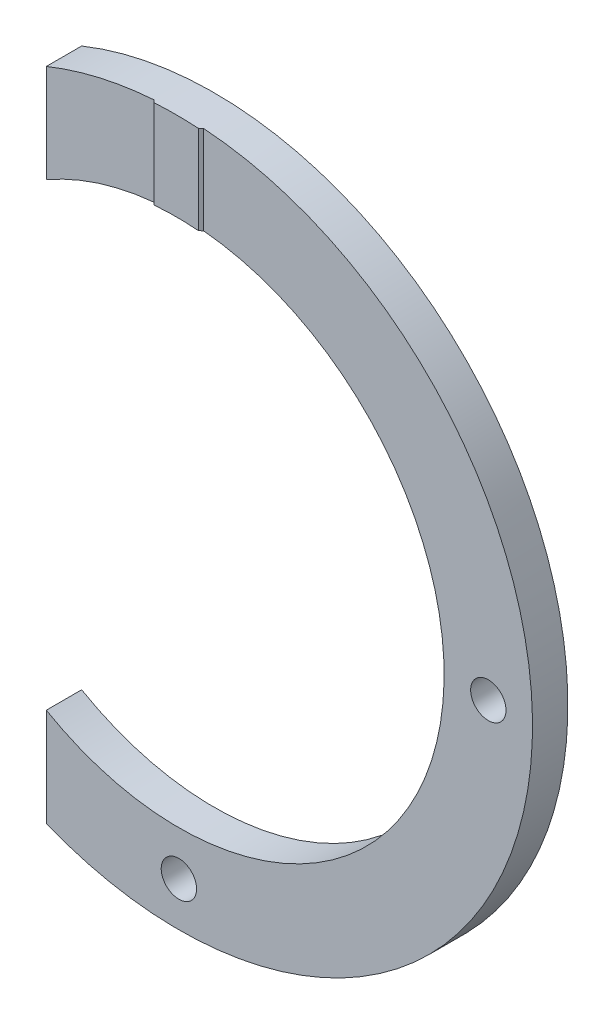
ISO-10303-21;
HEADER;
FILE_DESCRIPTION(('STEP AP214'),'2;1');
FILE_NAME('part.step','',(''),(''),'','','');
FILE_SCHEMA(('AUTOMOTIVE_DESIGN { 1 0 10303 214 1 1 1 1 }'));
ENDSEC;
DATA;
#1=APPLICATION_CONTEXT('core data for automotive mechanical design processes');
#2=APPLICATION_PROTOCOL_DEFINITION('international standard','automotive_design',2000,#1);
#3=PRODUCT_CONTEXT('',#1,'mechanical');
#4=PRODUCT('Part','Part','',(#3));
#5=PRODUCT_RELATED_PRODUCT_CATEGORY('part','',(#4));
#6=PRODUCT_DEFINITION_FORMATION('','',#4);
#7=PRODUCT_DEFINITION_CONTEXT('part definition',#1,'design');
#8=PRODUCT_DEFINITION('design','',#6,#7);
#9=PRODUCT_DEFINITION_SHAPE('','',#8);
#10=(LENGTH_UNIT() NAMED_UNIT(*) SI_UNIT(.MILLI.,.METRE.));
#11=(NAMED_UNIT(*) PLANE_ANGLE_UNIT() SI_UNIT($,.RADIAN.));
#12=(NAMED_UNIT(*) SI_UNIT($,.STERADIAN.) SOLID_ANGLE_UNIT());
#13=UNCERTAINTY_MEASURE_WITH_UNIT(LENGTH_MEASURE(1.E-05),#10,'distance_accuracy_value','');
#14=(GEOMETRIC_REPRESENTATION_CONTEXT(3) GLOBAL_UNCERTAINTY_ASSIGNED_CONTEXT((#13)) GLOBAL_UNIT_ASSIGNED_CONTEXT((#10,
#11,#12)) REPRESENTATION_CONTEXT('',''));
#15=CARTESIAN_POINT('',(0.,0.,0.));
#16=DIRECTION('',(0.,0.,1.));
#17=DIRECTION('',(1.,0.,0.));
#18=AXIS2_PLACEMENT_3D('',#15,#16,#17);
#19=CARTESIAN_POINT('',(-2.8,0.,2.));
#20=DIRECTION('',(-0.707106781186549,0.,0.707106781186547));
#21=DIRECTION('',(0.707106781186547,0.,0.707106781186549));
#22=AXIS2_PLACEMENT_3D('',#19,#20,#21);
#23=PLANE('',#22);
#24=CARTESIAN_POINT('',(0.,0.,4.80000000000001));
#25=DIRECTION('',(-0.707106781186549,0.,0.707106781186547));
#26=DIRECTION('',(-0.707106781186547,0.,-0.707106781186549));
#27=AXIS2_PLACEMENT_3D('',#24,#25,#26);
#28=ELLIPSE('',#27,42.4264068711929,30.);
#29=CARTESIAN_POINT('',(-2.8,29.8690475241511,2.));
#30=VERTEX_POINT('',#29);
#31=CARTESIAN_POINT('',(-2.5,29.8956518577535,2.3));
#32=VERTEX_POINT('',#31);
#33=EDGE_CURVE('E91',#30,#32,#28,.F.);
#34=ORIENTED_EDGE('',*,*,#33,.T.);
#35=DIRECTION('',(0.,1.,0.));
#36=VECTOR('',#35,1.);
#37=CARTESIAN_POINT('',(-2.5,0.,2.3));
#38=LINE('',#37,#36);
#39=CARTESIAN_POINT('',(-2.5,39.9217985566783,2.3));
#40=VERTEX_POINT('',#39);
#41=EDGE_CURVE('E89',#40,#32,#38,.F.);
#42=ORIENTED_EDGE('',*,*,#41,.F.);
#43=CARTESIAN_POINT('',(0.,0.,4.80000000000001));
#44=DIRECTION('',(-0.707106781186549,0.,0.707106781186547));
#45=DIRECTION('',(0.707106781186547,0.,0.707106781186549));
#46=AXIS2_PLACEMENT_3D('',#43,#44,#45);
#47=ELLIPSE('',#46,56.5685424949239,40.);
#48=CARTESIAN_POINT('',(-2.8,39.9018796549736,2.));
#49=VERTEX_POINT('',#48);
#50=EDGE_CURVE('E22',#40,#49,#47,.T.);
#51=ORIENTED_EDGE('',*,*,#50,.T.);
#52=DIRECTION('',(0.,1.,0.));
#53=VECTOR('',#52,1.);
#54=CARTESIAN_POINT('',(-2.8,0.,2.));
#55=LINE('',#54,#53);
#56=EDGE_CURVE('E86',#30,#49,#55,.T.);
#57=ORIENTED_EDGE('',*,*,#56,.F.);
#58=EDGE_LOOP('',(#34,#42,#51,#57));
#59=FACE_BOUND('',#58,.T.);
#60=ADVANCED_FACE('F19',(#59),#23,.T.);
#61=CARTESIAN_POINT('',(2.5,0.,2.3));
#62=DIRECTION('',(0.707106781186549,0.,0.707106781186547));
#63=DIRECTION('',(0.707106781186547,0.,-0.707106781186549));
#64=AXIS2_PLACEMENT_3D('',#61,#62,#63);
#65=PLANE('',#64);
#66=CARTESIAN_POINT('',(0.,0.,4.80000000000001));
#67=DIRECTION('',(0.707106781186549,0.,0.707106781186547));
#68=DIRECTION('',(0.707106781186547,0.,-0.707106781186549));
#69=AXIS2_PLACEMENT_3D('',#66,#67,#68);
#70=ELLIPSE('',#69,42.4264068711929,30.);
#71=CARTESIAN_POINT('',(2.5,29.8956518577535,2.3));
#72=VERTEX_POINT('',#71);
#73=CARTESIAN_POINT('',(2.8,29.8690475241511,2.));
#74=VERTEX_POINT('',#73);
#75=EDGE_CURVE('E113',#72,#74,#70,.F.);
#76=ORIENTED_EDGE('',*,*,#75,.T.);
#77=DIRECTION('',(0.,1.,0.));
#78=VECTOR('',#77,1.);
#79=CARTESIAN_POINT('',(2.8,0.,2.));
#80=LINE('',#79,#78);
#81=CARTESIAN_POINT('',(2.8,39.9018796549736,2.));
#82=VERTEX_POINT('',#81);
#83=EDGE_CURVE('E99',#82,#74,#80,.F.);
#84=ORIENTED_EDGE('',*,*,#83,.F.);
#85=CARTESIAN_POINT('',(0.,0.,4.80000000000001));
#86=DIRECTION('',(0.707106781186549,0.,0.707106781186547));
#87=DIRECTION('',(-0.707106781186547,0.,0.707106781186549));
#88=AXIS2_PLACEMENT_3D('',#85,#86,#87);
#89=ELLIPSE('',#88,56.5685424949239,40.);
#90=CARTESIAN_POINT('',(2.5,39.9217985566783,2.3));
#91=VERTEX_POINT('',#90);
#92=EDGE_CURVE('E115',#82,#91,#89,.T.);
#93=ORIENTED_EDGE('',*,*,#92,.T.);
#94=DIRECTION('',(0.,1.,0.));
#95=VECTOR('',#94,1.);
#96=CARTESIAN_POINT('',(2.5,0.,2.3));
#97=LINE('',#96,#95);
#98=EDGE_CURVE('E100',#72,#91,#97,.T.);
#99=ORIENTED_EDGE('',*,*,#98,.F.);
#100=EDGE_LOOP('',(#76,#84,#93,#99));
#101=FACE_BOUND('',#100,.T.);
#102=ADVANCED_FACE('F184',(#101),#65,.T.);
#103=CARTESIAN_POINT('',(-2.5,0.,2.3));
#104=DIRECTION('',(0.,0.,1.));
#105=DIRECTION('',(1.,0.,0.));
#106=AXIS2_PLACEMENT_3D('',#103,#104,#105);
#107=PLANE('',#106);
#108=CARTESIAN_POINT('',(0.,0.,2.3));
#109=DIRECTION('',(0.,0.,-1.));
#110=DIRECTION('',(-1.,0.,0.));
#111=AXIS2_PLACEMENT_3D('',#108,#109,#110);
#112=CIRCLE('',#111,30.);
#113=EDGE_CURVE('E122',#32,#72,#112,.T.);
#114=ORIENTED_EDGE('',*,*,#113,.T.);
#115=ORIENTED_EDGE('',*,*,#98,.T.);
#116=CARTESIAN_POINT('',(0.,0.,2.3));
#117=DIRECTION('',(0.,0.,1.));
#118=DIRECTION('',(1.,0.,0.));
#119=AXIS2_PLACEMENT_3D('',#116,#117,#118);
#120=CIRCLE('',#119,40.);
#121=EDGE_CURVE('E105',#40,#91,#120,.F.);
#122=ORIENTED_EDGE('',*,*,#121,.F.);
#123=ORIENTED_EDGE('',*,*,#41,.T.);
#124=EDGE_LOOP('',(#114,#115,#122,#123));
#125=FACE_BOUND('',#124,.T.);
#126=ADVANCED_FACE('F120',(#125),#107,.T.);
#127=CARTESIAN_POINT('',(0.,0.,2.));
#128=DIRECTION('',(0.,0.,1.));
#129=DIRECTION('',(1.,0.,0.));
#130=AXIS2_PLACEMENT_3D('',#127,#128,#129);
#131=PLANE('',#130);
#132=DIRECTION('',(0.,-1.,0.));
#133=VECTOR('',#132,1.);
#134=CARTESIAN_POINT('',(-15.,37.0809924354783,2.));
#135=LINE('',#134,#133);
#136=CARTESIAN_POINT('',(-15.,25.9807621135332,2.));
#137=VERTEX_POINT('',#136);
#138=CARTESIAN_POINT('',(-15.,37.0809924354783,2.));
#139=VERTEX_POINT('',#138);
#140=EDGE_CURVE('E108',#137,#139,#135,.F.);
#141=ORIENTED_EDGE('',*,*,#140,.F.);
#142=CARTESIAN_POINT('',(0.,0.,2.));
#143=DIRECTION('',(0.,0.,-1.));
#144=DIRECTION('',(-1.,0.,0.));
#145=AXIS2_PLACEMENT_3D('',#142,#143,#144);
#146=CIRCLE('',#145,30.);
#147=EDGE_CURVE('E98',#137,#30,#146,.T.);
#148=ORIENTED_EDGE('',*,*,#147,.T.);
#149=ORIENTED_EDGE('',*,*,#56,.T.);
#150=CARTESIAN_POINT('',(0.,0.,2.));
#151=DIRECTION('',(0.,0.,1.));
#152=DIRECTION('',(1.,0.,0.));
#153=AXIS2_PLACEMENT_3D('',#150,#151,#152);
#154=CIRCLE('',#153,40.);
#155=EDGE_CURVE('E95',#139,#49,#154,.F.);
#156=ORIENTED_EDGE('',*,*,#155,.F.);
#157=EDGE_LOOP('',(#141,#148,#149,#156));
#158=FACE_BOUND('',#157,.T.);
#159=ADVANCED_FACE('F94',(#158),#131,.T.);
#160=CARTESIAN_POINT('',(0.,0.,2.));
#161=DIRECTION('',(0.,0.,1.));
#162=DIRECTION('',(1.,0.,0.));
#163=AXIS2_PLACEMENT_3D('',#160,#161,#162);
#164=PLANE('',#163);
#165=CARTESIAN_POINT('',(35.,0.,2.));
#166=DIRECTION('',(0.,0.,1.));
#167=DIRECTION('',(1.,0.,0.));
#168=AXIS2_PLACEMENT_3D('',#165,#166,#167);
#169=CIRCLE('',#168,2.);
#170=CARTESIAN_POINT('',(37.,0.,2.));
#171=VERTEX_POINT('',#170);
#172=EDGE_CURVE('E141',#171,#171,#169,.F.);
#173=ORIENTED_EDGE('',*,*,#172,.T.);
#174=EDGE_LOOP('',(#173));
#175=FACE_BOUND('',#174,.T.);
#176=CARTESIAN_POINT('',(0.,-35.,2.));
#177=DIRECTION('',(0.,0.,1.));
#178=DIRECTION('',(1.,0.,0.));
#179=AXIS2_PLACEMENT_3D('',#176,#177,#178);
#180=CIRCLE('',#179,2.);
#181=CARTESIAN_POINT('',(1.99999999999999,-35.,2.));
#182=VERTEX_POINT('',#181);
#183=EDGE_CURVE('E144',#182,#182,#180,.F.);
#184=ORIENTED_EDGE('',*,*,#183,.T.);
#185=EDGE_LOOP('',(#184));
#186=FACE_BOUND('',#185,.T.);
#187=DIRECTION('',(0.,-1.,0.));
#188=VECTOR('',#187,1.);
#189=CARTESIAN_POINT('',(-15.,-25.9807621135332,2.));
#190=LINE('',#189,#188);
#191=CARTESIAN_POINT('',(-15.,-37.0809924354783,2.));
#192=VERTEX_POINT('',#191);
#193=CARTESIAN_POINT('',(-15.,-25.9807621135332,2.));
#194=VERTEX_POINT('',#193);
#195=EDGE_CURVE('E159',#192,#194,#190,.F.);
#196=ORIENTED_EDGE('',*,*,#195,.F.);
#197=CARTESIAN_POINT('',(0.,0.,2.));
#198=DIRECTION('',(0.,0.,1.));
#199=DIRECTION('',(1.,0.,0.));
#200=AXIS2_PLACEMENT_3D('',#197,#198,#199);
#201=CIRCLE('',#200,40.);
#202=EDGE_CURVE('E106',#82,#192,#201,.F.);
#203=ORIENTED_EDGE('',*,*,#202,.F.);
#204=ORIENTED_EDGE('',*,*,#83,.T.);
#205=CARTESIAN_POINT('',(0.,0.,2.));
#206=DIRECTION('',(0.,0.,-1.));
#207=DIRECTION('',(-1.,0.,0.));
#208=AXIS2_PLACEMENT_3D('',#205,#206,#207);
#209=CIRCLE('',#208,30.);
#210=EDGE_CURVE('E127',#74,#194,#209,.T.);
#211=ORIENTED_EDGE('',*,*,#210,.T.);
#212=EDGE_LOOP('',(#196,#203,#204,#211));
#213=FACE_BOUND('',#212,.T.);
#214=ADVANCED_FACE('F182',(#175,#186,#213),#164,.T.);
#215=CARTESIAN_POINT('',(0.,0.,-2.));
#216=DIRECTION('',(0.,0.,1.));
#217=DIRECTION('',(1.,0.,0.));
#218=AXIS2_PLACEMENT_3D('',#215,#216,#217);
#219=CYLINDRICAL_SURFACE('',#218,40.);
#220=ORIENTED_EDGE('',*,*,#121,.T.);
#221=ORIENTED_EDGE('',*,*,#92,.F.);
#222=ORIENTED_EDGE('',*,*,#202,.T.);
#223=DIRECTION('',(0.,0.,1.));
#224=VECTOR('',#223,1.);
#225=CARTESIAN_POINT('',(-15.,-37.0809924354783,-2.));
#226=LINE('',#225,#224);
#227=CARTESIAN_POINT('',(-15.,-37.0809924354783,-2.));
#228=VERTEX_POINT('',#227);
#229=EDGE_CURVE('E140',#228,#192,#226,.T.);
#230=ORIENTED_EDGE('',*,*,#229,.F.);
#231=CARTESIAN_POINT('',(0.,0.,-2.));
#232=DIRECTION('',(0.,0.,1.));
#233=DIRECTION('',(1.,0.,0.));
#234=AXIS2_PLACEMENT_3D('',#231,#232,#233);
#235=CIRCLE('',#234,40.);
#236=CARTESIAN_POINT('',(-15.,37.0809924354783,-2.));
#237=VERTEX_POINT('',#236);
#238=EDGE_CURVE('E147',#228,#237,#235,.T.);
#239=ORIENTED_EDGE('',*,*,#238,.T.);
#240=DIRECTION('',(0.,0.,1.));
#241=VECTOR('',#240,1.);
#242=CARTESIAN_POINT('',(-15.,37.0809924354783,-2.));
#243=LINE('',#242,#241);
#244=EDGE_CURVE('E104',#139,#237,#243,.F.);
#245=ORIENTED_EDGE('',*,*,#244,.F.);
#246=ORIENTED_EDGE('',*,*,#155,.T.);
#247=ORIENTED_EDGE('',*,*,#50,.F.);
#248=EDGE_LOOP('',(#220,#221,#222,#230,#239,#245,#246,#247));
#249=FACE_BOUND('',#248,.T.);
#250=ADVANCED_FACE('F102',(#249),#219,.T.);
#251=CARTESIAN_POINT('',(-15.,37.0809924354783,-2.));
#252=DIRECTION('',(-1.,0.,0.));
#253=DIRECTION('',(0.,-1.,0.));
#254=AXIS2_PLACEMENT_3D('',#251,#252,#253);
#255=PLANE('',#254);
#256=ORIENTED_EDGE('',*,*,#140,.T.);
#257=ORIENTED_EDGE('',*,*,#244,.T.);
#258=DIRECTION('',(0.,1.,0.));
#259=VECTOR('',#258,1.);
#260=CARTESIAN_POINT('',(-15.,0.,-2.));
#261=LINE('',#260,#259);
#262=CARTESIAN_POINT('',(-15.,25.9807621135332,-2.));
#263=VERTEX_POINT('',#262);
#264=EDGE_CURVE('E148',#237,#263,#261,.F.);
#265=ORIENTED_EDGE('',*,*,#264,.T.);
#266=DIRECTION('',(0.,0.,-1.));
#267=VECTOR('',#266,1.);
#268=CARTESIAN_POINT('',(-15.,25.9807621135332,-2.));
#269=LINE('',#268,#267);
#270=EDGE_CURVE('E129',#263,#137,#269,.F.);
#271=ORIENTED_EDGE('',*,*,#270,.T.);
#272=EDGE_LOOP('',(#256,#257,#265,#271));
#273=FACE_BOUND('',#272,.T.);
#274=ADVANCED_FACE('F178',(#273),#255,.T.);
#275=CARTESIAN_POINT('',(0.,0.,-2.));
#276=DIRECTION('',(0.,0.,-1.));
#277=DIRECTION('',(-1.,0.,0.));
#278=AXIS2_PLACEMENT_3D('',#275,#276,#277);
#279=CYLINDRICAL_SURFACE('',#278,30.);
#280=ORIENTED_EDGE('',*,*,#270,.F.);
#281=CARTESIAN_POINT('',(0.,0.,-2.));
#282=DIRECTION('',(0.,0.,-1.));
#283=DIRECTION('',(-1.,0.,0.));
#284=AXIS2_PLACEMENT_3D('',#281,#282,#283);
#285=CIRCLE('',#284,30.);
#286=CARTESIAN_POINT('',(-15.,-25.9807621135332,-2.));
#287=VERTEX_POINT('',#286);
#288=EDGE_CURVE('E149',#263,#287,#285,.T.);
#289=ORIENTED_EDGE('',*,*,#288,.T.);
#290=DIRECTION('',(0.,0.,1.));
#291=VECTOR('',#290,1.);
#292=CARTESIAN_POINT('',(-15.,-25.9807621135332,-2.));
#293=LINE('',#292,#291);
#294=EDGE_CURVE('E37',#194,#287,#293,.F.);
#295=ORIENTED_EDGE('',*,*,#294,.F.);
#296=ORIENTED_EDGE('',*,*,#210,.F.);
#297=ORIENTED_EDGE('',*,*,#75,.F.);
#298=ORIENTED_EDGE('',*,*,#113,.F.);
#299=ORIENTED_EDGE('',*,*,#33,.F.);
#300=ORIENTED_EDGE('',*,*,#147,.F.);
#301=EDGE_LOOP('',(#280,#289,#295,#296,#297,#298,#299,#300));
#302=FACE_BOUND('',#301,.T.);
#303=ADVANCED_FACE('F124',(#302),#279,.F.);
#304=CARTESIAN_POINT('',(-15.,-25.9807621135332,-2.));
#305=DIRECTION('',(-1.,0.,0.));
#306=DIRECTION('',(0.,-1.,0.));
#307=AXIS2_PLACEMENT_3D('',#304,#305,#306);
#308=PLANE('',#307);
#309=ORIENTED_EDGE('',*,*,#195,.T.);
#310=ORIENTED_EDGE('',*,*,#294,.T.);
#311=DIRECTION('',(0.,1.,0.));
#312=VECTOR('',#311,1.);
#313=CARTESIAN_POINT('',(-15.,0.,-2.));
#314=LINE('',#313,#312);
#315=EDGE_CURVE('E153',#287,#228,#314,.F.);
#316=ORIENTED_EDGE('',*,*,#315,.T.);
#317=ORIENTED_EDGE('',*,*,#229,.T.);
#318=EDGE_LOOP('',(#309,#310,#316,#317));
#319=FACE_BOUND('',#318,.T.);
#320=ADVANCED_FACE('F170',(#319),#308,.T.);
#321=CARTESIAN_POINT('',(35.,0.,-2.));
#322=DIRECTION('',(0.,0.,1.));
#323=DIRECTION('',(1.,0.,0.));
#324=AXIS2_PLACEMENT_3D('',#321,#322,#323);
#325=CYLINDRICAL_SURFACE('',#324,2.);
#326=CARTESIAN_POINT('',(35.,0.,-2.));
#327=DIRECTION('',(0.,0.,1.));
#328=DIRECTION('',(1.,0.,0.));
#329=AXIS2_PLACEMENT_3D('',#326,#327,#328);
#330=CIRCLE('',#329,2.);
#331=CARTESIAN_POINT('',(37.,0.,-2.));
#332=VERTEX_POINT('',#331);
#333=EDGE_CURVE('E28',#332,#332,#330,.F.);
#334=ORIENTED_EDGE('',*,*,#333,.T.);
#335=EDGE_LOOP('',(#334));
#336=FACE_BOUND('',#335,.T.);
#337=ORIENTED_EDGE('',*,*,#172,.F.);
#338=EDGE_LOOP('',(#337));
#339=FACE_BOUND('',#338,.T.);
#340=ADVANCED_FACE('F199',(#336,#339),#325,.F.);
#341=CARTESIAN_POINT('',(0.,-35.,-2.));
#342=DIRECTION('',(0.,0.,1.));
#343=DIRECTION('',(1.,0.,0.));
#344=AXIS2_PLACEMENT_3D('',#341,#342,#343);
#345=CYLINDRICAL_SURFACE('',#344,2.);
#346=CARTESIAN_POINT('',(0.,-35.,-2.));
#347=DIRECTION('',(0.,0.,1.));
#348=DIRECTION('',(1.,0.,0.));
#349=AXIS2_PLACEMENT_3D('',#346,#347,#348);
#350=CIRCLE('',#349,2.);
#351=CARTESIAN_POINT('',(1.99999999999999,-35.,-2.));
#352=VERTEX_POINT('',#351);
#353=EDGE_CURVE('E12',#352,#352,#350,.F.);
#354=ORIENTED_EDGE('',*,*,#353,.T.);
#355=EDGE_LOOP('',(#354));
#356=FACE_BOUND('',#355,.T.);
#357=ORIENTED_EDGE('',*,*,#183,.F.);
#358=EDGE_LOOP('',(#357));
#359=FACE_BOUND('',#358,.T.);
#360=ADVANCED_FACE('F193',(#356,#359),#345,.F.);
#361=CARTESIAN_POINT('',(0.,0.,-2.));
#362=DIRECTION('',(0.,0.,1.));
#363=DIRECTION('',(1.,0.,0.));
#364=AXIS2_PLACEMENT_3D('',#361,#362,#363);
#365=PLANE('',#364);
#366=ORIENTED_EDGE('',*,*,#353,.F.);
#367=EDGE_LOOP('',(#366));
#368=FACE_BOUND('',#367,.T.);
#369=ORIENTED_EDGE('',*,*,#333,.F.);
#370=EDGE_LOOP('',(#369));
#371=FACE_BOUND('',#370,.T.);
#372=ORIENTED_EDGE('',*,*,#288,.F.);
#373=ORIENTED_EDGE('',*,*,#264,.F.);
#374=ORIENTED_EDGE('',*,*,#238,.F.);
#375=ORIENTED_EDGE('',*,*,#315,.F.);
#376=EDGE_LOOP('',(#372,#373,#374,#375));
#377=FACE_BOUND('',#376,.T.);
#378=ADVANCED_FACE('F175',(#368,#371,#377),#365,.F.);
#379=CLOSED_SHELL('',(#60,#102,#126,#159,#214,#250,#274,#303,#320,#340,#360,#378));
#380=MANIFOLD_SOLID_BREP('B1',#379);
#381=ADVANCED_BREP_SHAPE_REPRESENTATION('',(#18,#380),#14);
#382=SHAPE_DEFINITION_REPRESENTATION(#9,#381);
ENDSEC;
END-ISO-10303-21;
